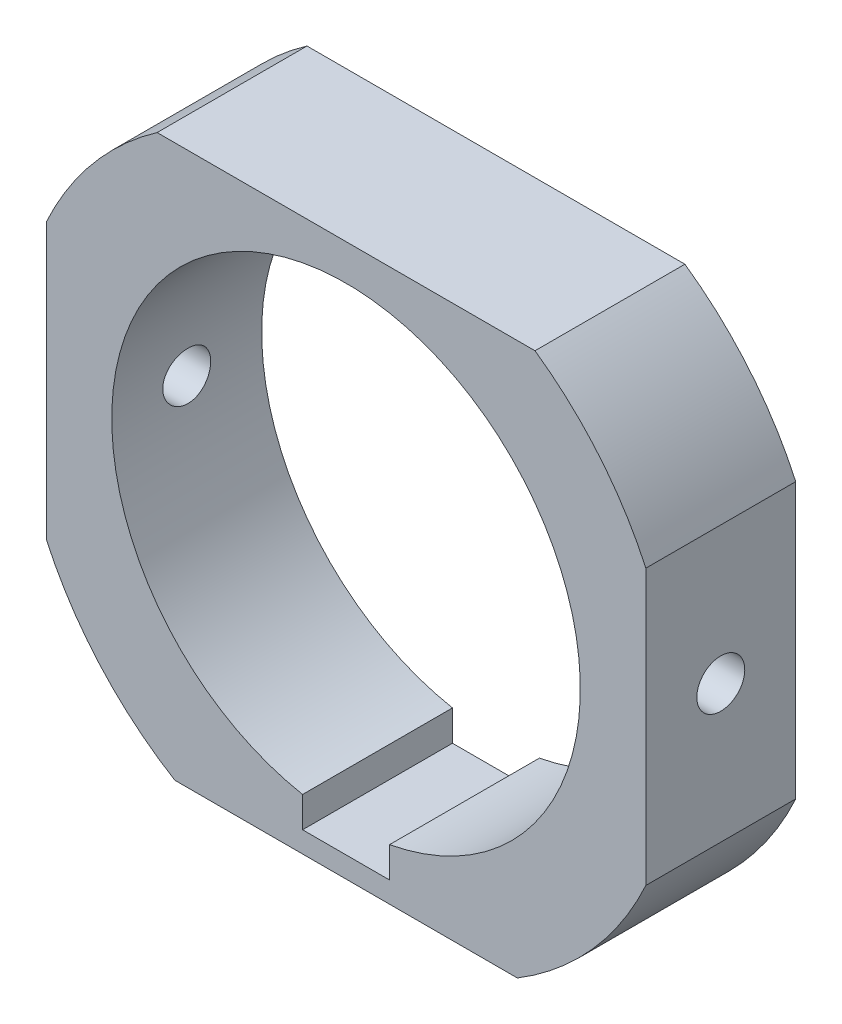
ISO-10303-21;
HEADER;
FILE_DESCRIPTION(('STEP AP214'),'2;1');
FILE_NAME('part.step','',(''),(''),'','','');
FILE_SCHEMA(('AUTOMOTIVE_DESIGN { 1 0 10303 214 1 1 1 1 }'));
ENDSEC;
DATA;
#1=APPLICATION_CONTEXT('core data for automotive mechanical design processes');
#2=APPLICATION_PROTOCOL_DEFINITION('international standard','automotive_design',2000,#1);
#3=PRODUCT_CONTEXT('',#1,'mechanical');
#4=PRODUCT('Part','Part','',(#3));
#5=PRODUCT_RELATED_PRODUCT_CATEGORY('part','',(#4));
#6=PRODUCT_DEFINITION_FORMATION('','',#4);
#7=PRODUCT_DEFINITION_CONTEXT('part definition',#1,'design');
#8=PRODUCT_DEFINITION('design','',#6,#7);
#9=PRODUCT_DEFINITION_SHAPE('','',#8);
#10=(LENGTH_UNIT() NAMED_UNIT(*) SI_UNIT(.MILLI.,.METRE.));
#11=(NAMED_UNIT(*) PLANE_ANGLE_UNIT() SI_UNIT($,.RADIAN.));
#12=(NAMED_UNIT(*) SI_UNIT($,.STERADIAN.) SOLID_ANGLE_UNIT());
#13=UNCERTAINTY_MEASURE_WITH_UNIT(LENGTH_MEASURE(1.E-05),#10,'distance_accuracy_value','');
#14=(GEOMETRIC_REPRESENTATION_CONTEXT(3) GLOBAL_UNCERTAINTY_ASSIGNED_CONTEXT((#13)) GLOBAL_UNIT_ASSIGNED_CONTEXT((#10,
#11,#12)) REPRESENTATION_CONTEXT('',''));
#15=CARTESIAN_POINT('',(0.,0.,0.));
#16=DIRECTION('',(0.,0.,1.));
#17=DIRECTION('',(1.,0.,0.));
#18=AXIS2_PLACEMENT_3D('',#15,#16,#17);
#19=CARTESIAN_POINT('',(10.,0.,5.));
#20=DIRECTION('',(1.,0.,0.));
#21=DIRECTION('',(0.,1.,0.));
#22=AXIS2_PLACEMENT_3D('',#19,#20,#21);
#23=PLANE('',#22);
#24=CARTESIAN_POINT('',(10.,0.,2.5));
#25=DIRECTION('',(1.,0.,0.));
#26=DIRECTION('',(0.,1.,0.));
#27=AXIS2_PLACEMENT_3D('',#24,#25,#26);
#28=CIRCLE('',#27,0.8);
#29=CARTESIAN_POINT('',(10.,0.799999999999986,2.5));
#30=VERTEX_POINT('',#29);
#31=EDGE_CURVE('E295',#30,#30,#28,.T.);
#32=ORIENTED_EDGE('',*,*,#31,.F.);
#33=EDGE_LOOP('',(#32));
#34=FACE_BOUND('',#33,.T.);
#35=DIRECTION('',(0.,-1.,0.));
#36=VECTOR('',#35,1.);
#37=CARTESIAN_POINT('',(10.,0.,0.));
#38=LINE('',#37,#36);
#39=CARTESIAN_POINT('',(10.,4.58257569495583,0.));
#40=VERTEX_POINT('',#39);
#41=CARTESIAN_POINT('',(10.,-4.58257569495586,0.));
#42=VERTEX_POINT('',#41);
#43=EDGE_CURVE('E245',#40,#42,#38,.T.);
#44=ORIENTED_EDGE('',*,*,#43,.F.);
#45=DIRECTION('',(0.,0.,-1.));
#46=VECTOR('',#45,1.);
#47=CARTESIAN_POINT('',(10.,4.58257569495583,5.));
#48=LINE('',#47,#46);
#49=CARTESIAN_POINT('',(10.,4.58257569495583,5.));
#50=VERTEX_POINT('',#49);
#51=EDGE_CURVE('E48',#50,#40,#48,.T.);
#52=ORIENTED_EDGE('',*,*,#51,.F.);
#53=DIRECTION('',(0.,-1.,0.));
#54=VECTOR('',#53,1.);
#55=CARTESIAN_POINT('',(10.,0.,5.));
#56=LINE('',#55,#54);
#57=CARTESIAN_POINT('',(10.,-4.58257569495586,5.));
#58=VERTEX_POINT('',#57);
#59=EDGE_CURVE('E262',#50,#58,#56,.T.);
#60=ORIENTED_EDGE('',*,*,#59,.T.);
#61=DIRECTION('',(0.,0.,-1.));
#62=VECTOR('',#61,1.);
#63=CARTESIAN_POINT('',(10.,-4.58257569495586,5.));
#64=LINE('',#63,#62);
#65=EDGE_CURVE('E167',#58,#42,#64,.T.);
#66=ORIENTED_EDGE('',*,*,#65,.T.);
#67=EDGE_LOOP('',(#44,#52,#60,#66));
#68=FACE_BOUND('',#67,.T.);
#69=ADVANCED_FACE('F35',(#34,#68),#23,.T.);
#70=CARTESIAN_POINT('',(0.,0.,5.));
#71=DIRECTION('',(0.,0.,-1.));
#72=DIRECTION('',(-1.,0.,0.));
#73=AXIS2_PLACEMENT_3D('',#70,#71,#72);
#74=CYLINDRICAL_SURFACE('',#73,11.);
#75=CARTESIAN_POINT('',(0.,0.,0.));
#76=DIRECTION('',(0.,0.,1.));
#77=DIRECTION('',(1.,0.,0.));
#78=AXIS2_PLACEMENT_3D('',#75,#76,#77);
#79=CIRCLE('',#78,11.);
#80=CARTESIAN_POINT('',(6.30315595555117,9.01499999999999,0.));
#81=VERTEX_POINT('',#80);
#82=EDGE_CURVE('E251',#40,#81,#79,.T.);
#83=ORIENTED_EDGE('',*,*,#82,.T.);
#84=DIRECTION('',(0.,0.,-1.));
#85=VECTOR('',#84,1.);
#86=CARTESIAN_POINT('',(6.30315595555117,9.01499999999999,5.));
#87=LINE('',#86,#85);
#88=CARTESIAN_POINT('',(6.30315595555117,9.01499999999999,5.));
#89=VERTEX_POINT('',#88);
#90=EDGE_CURVE('E165',#89,#81,#87,.T.);
#91=ORIENTED_EDGE('',*,*,#90,.F.);
#92=CARTESIAN_POINT('',(0.,0.,5.));
#93=DIRECTION('',(0.,0.,1.));
#94=DIRECTION('',(1.,0.,0.));
#95=AXIS2_PLACEMENT_3D('',#92,#93,#94);
#96=CIRCLE('',#95,11.);
#97=EDGE_CURVE('E159',#50,#89,#96,.T.);
#98=ORIENTED_EDGE('',*,*,#97,.F.);
#99=ORIENTED_EDGE('',*,*,#51,.T.);
#100=EDGE_LOOP('',(#83,#91,#98,#99));
#101=FACE_BOUND('',#100,.T.);
#102=ADVANCED_FACE('F204',(#101),#74,.T.);
#103=CARTESIAN_POINT('',(0.,9.01499999999998,5.));
#104=DIRECTION('',(0.,1.,0.));
#105=DIRECTION('',(-1.,0.,0.));
#106=AXIS2_PLACEMENT_3D('',#103,#104,#105);
#107=PLANE('',#106);
#108=DIRECTION('',(1.,0.,0.));
#109=VECTOR('',#108,1.);
#110=CARTESIAN_POINT('',(0.,9.01499999999998,0.));
#111=LINE('',#110,#109);
#112=CARTESIAN_POINT('',(-6.30315595555117,9.01499999999998,0.));
#113=VERTEX_POINT('',#112);
#114=EDGE_CURVE('E254',#113,#81,#111,.T.);
#115=ORIENTED_EDGE('',*,*,#114,.F.);
#116=DIRECTION('',(0.,0.,-1.));
#117=VECTOR('',#116,1.);
#118=CARTESIAN_POINT('',(-6.30315595555117,9.01499999999998,5.));
#119=LINE('',#118,#117);
#120=CARTESIAN_POINT('',(-6.30315595555117,9.01499999999998,5.));
#121=VERTEX_POINT('',#120);
#122=EDGE_CURVE('E163',#121,#113,#119,.T.);
#123=ORIENTED_EDGE('',*,*,#122,.F.);
#124=DIRECTION('',(1.,0.,0.));
#125=VECTOR('',#124,1.);
#126=CARTESIAN_POINT('',(0.,9.01499999999998,5.));
#127=LINE('',#126,#125);
#128=EDGE_CURVE('E156',#121,#89,#127,.T.);
#129=ORIENTED_EDGE('',*,*,#128,.T.);
#130=ORIENTED_EDGE('',*,*,#90,.T.);
#131=EDGE_LOOP('',(#115,#123,#129,#130));
#132=FACE_BOUND('',#131,.T.);
#133=ADVANCED_FACE('F209',(#132),#107,.T.);
#134=CARTESIAN_POINT('',(-10.,4.58257569495583,0.));
#135=VERTEX_POINT('',#134);
#136=EDGE_CURVE('E162',#113,#135,#79,.T.);
#137=ORIENTED_EDGE('',*,*,#136,.T.);
#138=DIRECTION('',(0.,0.,-1.));
#139=VECTOR('',#138,1.);
#140=CARTESIAN_POINT('',(-10.,4.58257569495583,5.));
#141=LINE('',#140,#139);
#142=CARTESIAN_POINT('',(-10.,4.58257569495583,5.));
#143=VERTEX_POINT('',#142);
#144=EDGE_CURVE('E143',#143,#135,#141,.T.);
#145=ORIENTED_EDGE('',*,*,#144,.F.);
#146=EDGE_CURVE('E149',#121,#143,#96,.T.);
#147=ORIENTED_EDGE('',*,*,#146,.F.);
#148=ORIENTED_EDGE('',*,*,#122,.T.);
#149=EDGE_LOOP('',(#137,#145,#147,#148));
#150=FACE_BOUND('',#149,.T.);
#151=ADVANCED_FACE('F160',(#150),#74,.T.);
#152=CARTESIAN_POINT('',(-10.,0.,5.));
#153=DIRECTION('',(1.,0.,0.));
#154=DIRECTION('',(0.,1.,0.));
#155=AXIS2_PLACEMENT_3D('',#152,#153,#154);
#156=PLANE('',#155);
#157=CARTESIAN_POINT('',(-10.,0.,2.5));
#158=DIRECTION('',(1.,0.,0.));
#159=DIRECTION('',(0.,1.,0.));
#160=AXIS2_PLACEMENT_3D('',#157,#158,#159);
#161=CIRCLE('',#160,0.8);
#162=CARTESIAN_POINT('',(-10.,0.799999999999993,2.5));
#163=VERTEX_POINT('',#162);
#164=EDGE_CURVE('E183',#163,#163,#161,.T.);
#165=ORIENTED_EDGE('',*,*,#164,.T.);
#166=EDGE_LOOP('',(#165));
#167=FACE_BOUND('',#166,.T.);
#168=DIRECTION('',(0.,-1.,0.));
#169=VECTOR('',#168,1.);
#170=CARTESIAN_POINT('',(-10.,0.,0.));
#171=LINE('',#170,#169);
#172=CARTESIAN_POINT('',(-10.,-4.58257569495586,0.));
#173=VERTEX_POINT('',#172);
#174=EDGE_CURVE('E257',#135,#173,#171,.T.);
#175=ORIENTED_EDGE('',*,*,#174,.T.);
#176=DIRECTION('',(0.,0.,-1.));
#177=VECTOR('',#176,1.);
#178=CARTESIAN_POINT('',(-10.,-4.58257569495586,5.));
#179=LINE('',#178,#177);
#180=CARTESIAN_POINT('',(-10.,-4.58257569495586,5.));
#181=VERTEX_POINT('',#180);
#182=EDGE_CURVE('E146',#181,#173,#179,.T.);
#183=ORIENTED_EDGE('',*,*,#182,.F.);
#184=DIRECTION('',(0.,-1.,0.));
#185=VECTOR('',#184,1.);
#186=CARTESIAN_POINT('',(-10.,0.,5.));
#187=LINE('',#186,#185);
#188=EDGE_CURVE('E138',#143,#181,#187,.T.);
#189=ORIENTED_EDGE('',*,*,#188,.F.);
#190=ORIENTED_EDGE('',*,*,#144,.T.);
#191=EDGE_LOOP('',(#175,#183,#189,#190));
#192=FACE_BOUND('',#191,.T.);
#193=ADVANCED_FACE('F141',(#167,#192),#156,.F.);
#194=CARTESIAN_POINT('',(-5.71314274283446,-9.39999999999991,0.));
#195=VERTEX_POINT('',#194);
#196=EDGE_CURVE('E258',#173,#195,#79,.T.);
#197=ORIENTED_EDGE('',*,*,#196,.T.);
#198=DIRECTION('',(0.,0.,-1.));
#199=VECTOR('',#198,1.);
#200=CARTESIAN_POINT('',(-5.71314274283446,-9.39999999999992,5.));
#201=LINE('',#200,#199);
#202=CARTESIAN_POINT('',(-5.71314274283446,-9.39999999999992,5.));
#203=VERTEX_POINT('',#202);
#204=EDGE_CURVE('E56',#195,#203,#201,.F.);
#205=ORIENTED_EDGE('',*,*,#204,.T.);
#206=EDGE_CURVE('E148',#181,#203,#96,.T.);
#207=ORIENTED_EDGE('',*,*,#206,.F.);
#208=ORIENTED_EDGE('',*,*,#182,.T.);
#209=EDGE_LOOP('',(#197,#205,#207,#208));
#210=FACE_BOUND('',#209,.T.);
#211=ADVANCED_FACE('F205',(#210),#74,.T.);
#212=CARTESIAN_POINT('',(0.,0.,5.));
#213=DIRECTION('',(0.,0.,-1.));
#214=DIRECTION('',(-1.,0.,0.));
#215=AXIS2_PLACEMENT_3D('',#212,#213,#214);
#216=CYLINDRICAL_SURFACE('',#215,7.815);
#217=CARTESIAN_POINT('',(-7.77394526607951,0.799999999999993,2.5));
#218=CARTESIAN_POINT('',(-7.77394580313387,0.799998061736724,2.54480986083474));
#219=CARTESIAN_POINT('',(-7.77433687554016,0.796222461421505,2.58964921208095));
#220=CARTESIAN_POINT('',(-7.77585866200741,0.781218110793491,2.67808432731466));
#221=CARTESIAN_POINT('',(-7.7769901875674,0.769981183046168,2.72167867206828));
#222=CARTESIAN_POINT('',(-7.77986339835153,0.740385165842795,2.8063303182318));
#223=CARTESIAN_POINT('',(-7.78160470984275,0.722030438091363,2.84738915554322));
#224=CARTESIAN_POINT('',(-7.78550083147618,0.678728308654285,2.92583457232231));
#225=CARTESIAN_POINT('',(-7.78765556045007,0.653782200725488,2.96322187046692));
#226=CARTESIAN_POINT('',(-7.79214491339251,0.597903538047323,3.03341388721079));
#227=CARTESIAN_POINT('',(-7.79448012139571,0.566951012774912,3.06620267183749));
#228=CARTESIAN_POINT('',(-7.79906201620008,0.49998085219694,3.12612966250422));
#229=CARTESIAN_POINT('',(-7.80130869891789,0.463962983594109,3.15326760813758));
#230=CARTESIAN_POINT('',(-7.80546619156765,0.387786694956044,3.20117784826974));
#231=CARTESIAN_POINT('',(-7.80737625188276,0.347619342075545,3.2219360103129));
#232=CARTESIAN_POINT('',(-7.81063892600844,0.264346264528616,3.256407013596));
#233=CARTESIAN_POINT('',(-7.81199155400921,0.221240614693136,3.27012003418189));
#234=CARTESIAN_POINT('',(-7.81398285836133,0.133475743653092,3.29006467616526));
#235=CARTESIAN_POINT('',(-7.81462403453344,0.0888225342662697,3.29632249856143));
#236=CARTESIAN_POINT('',(-7.81512869685544,-0.000904642598936509,3.30126018922979));
#237=CARTESIAN_POINT('',(-7.81499220406077,-0.0459785986525881,3.29994026267003));
#238=CARTESIAN_POINT('',(-7.81395895161461,-0.135089885253989,3.28978116942611));
#239=CARTESIAN_POINT('',(-7.8130650407122,-0.17913046546611,3.28097017720236));
#240=CARTESIAN_POINT('',(-7.81062067492937,-0.26510444888665,3.25612296925048));
#241=CARTESIAN_POINT('',(-7.80907021117161,-0.307037823594688,3.24008665582764));
#242=CARTESIAN_POINT('',(-7.8054821453633,-0.387695734955676,3.20121320525696));
#243=CARTESIAN_POINT('',(-7.80344365330647,-0.426414232913712,3.17836362399475));
#244=CARTESIAN_POINT('',(-7.79910820983128,-0.499477423321488,3.12652129082424));
#245=CARTESIAN_POINT('',(-7.79681125046814,-0.533821981255624,3.09752835005686));
#246=CARTESIAN_POINT('',(-7.79220414589193,-0.597327440619396,3.0340639028662));
#247=CARTESIAN_POINT('',(-7.78989398851402,-0.626463849431887,2.99956788334724));
#248=CARTESIAN_POINT('',(-7.78553135845153,-0.678536251311329,2.92616141675097));
#249=CARTESIAN_POINT('',(-7.78347888617073,-0.701472234662522,2.88725096275659));
#250=CARTESIAN_POINT('',(-7.77986384756677,-0.740492727854812,2.80610107404496));
#251=CARTESIAN_POINT('',(-7.77830139218661,-0.756575686421836,2.76386088815974));
#252=CARTESIAN_POINT('',(-7.77584556894412,-0.781414012766373,2.67726005353371));
#253=CARTESIAN_POINT('',(-7.77495217969918,-0.790169614719065,2.63289947260656));
#254=CARTESIAN_POINT('',(-7.77393935938322,-0.8000731032596,2.54353221157662));
#255=CARTESIAN_POINT('',(-7.77381644069682,-0.801255272319191,2.49852936850994));
#256=CARTESIAN_POINT('',(-7.7743492732361,-0.796068406801337,2.40896623093414));
#257=CARTESIAN_POINT('',(-7.77500501342687,-0.789699479235747,2.36440593016246));
#258=CARTESIAN_POINT('',(-7.77701810418348,-0.76961990917363,2.27709294812345));
#259=CARTESIAN_POINT('',(-7.77837390222677,-0.755925510011556,2.23433649248693));
#260=CARTESIAN_POINT('',(-7.78163308391878,-0.721600325154456,2.15172751213331));
#261=CARTESIAN_POINT('',(-7.78353648069191,-0.700969373207533,2.11187505704572));
#262=CARTESIAN_POINT('',(-7.78768482886165,-0.653270975015754,2.03604918064636));
#263=CARTESIAN_POINT('',(-7.78993097441594,-0.626180831331106,2.00009010354735));
#264=CARTESIAN_POINT('',(-7.79450784028217,-0.566365533474943,1.93321726603235));
#265=CARTESIAN_POINT('',(-7.79683856278782,-0.533640233059086,1.90230363659704));
#266=CARTESIAN_POINT('',(-7.80133251156171,-0.463334759082683,1.84628080771017));
#267=CARTESIAN_POINT('',(-7.80349507151783,-0.425736704829036,1.82119398660156));
#268=CARTESIAN_POINT('',(-7.80739930988799,-0.346841196308256,1.7776909622064));
#269=CARTESIAN_POINT('',(-7.8091409943082,-0.305543794844931,1.75927466372494));
#270=CARTESIAN_POINT('',(-7.81200423536476,-0.220499668639464,1.72967329156506));
#271=CARTESIAN_POINT('',(-7.81312694626303,-0.176757671572313,1.71847475156827));
#272=CARTESIAN_POINT('',(-7.81463048182995,-0.0880021608086677,1.70358284417057));
#273=CARTESIAN_POINT('',(-7.81501132841863,-0.0429886847207331,1.69988925501898));
#274=CARTESIAN_POINT('',(-7.81498820517644,0.0468123212288254,1.7001153008142));
#275=CARTESIAN_POINT('',(-7.81458781447629,0.0915999434503081,1.70400021587262));
#276=CARTESIAN_POINT('',(-7.81305427152202,0.179882711651269,1.719200124063));
#277=CARTESIAN_POINT('',(-7.81192111876967,0.223377856751913,1.73051512224701));
#278=CARTESIAN_POINT('',(-7.80904899208022,0.30784036159003,1.76024427250835));
#279=CARTESIAN_POINT('',(-7.80731010968926,0.348808102202667,1.77865735187158));
#280=CARTESIAN_POINT('',(-7.8034202474717,0.427077016176679,1.8220563003507));
#281=CARTESIAN_POINT('',(-7.80126926942119,0.464378205339359,1.84704214113903));
#282=CARTESIAN_POINT('',(-7.79678432930458,0.534433075382701,1.90300743396359));
#283=CARTESIAN_POINT('',(-7.79444960460488,0.567166050428364,1.93401274413989));
#284=CARTESIAN_POINT('',(-7.78986673365381,0.626979782575166,2.00108550945176));
#285=CARTESIAN_POINT('',(-7.78761860828681,0.654059183128778,2.03715417605081));
#286=CARTESIAN_POINT('',(-7.78345709954378,0.701854278379384,2.11343502634024));
#287=CARTESIAN_POINT('',(-7.78154461947297,0.722552910615729,2.15365794220618));
#288=CARTESIAN_POINT('',(-7.77828168033427,0.75687452262133,2.23700268007272));
#289=CARTESIAN_POINT('',(-7.77693058960545,0.770505459086838,2.28012118020647));
#290=CARTESIAN_POINT('',(-7.7752830595344,0.786917090265315,2.352901767449));
#291=CARTESIAN_POINT('',(-7.77478377002186,0.791816447095742,2.38209903892744));
#292=CARTESIAN_POINT('',(-7.7741146967887,0.79835853437849,2.44085992545233));
#293=CARTESIAN_POINT('',(-7.77394491160022,0.800001279338227,2.47042353886622));
#294=CARTESIAN_POINT('',(-7.77394526607951,0.799999999999993,2.5));
#295=B_SPLINE_CURVE_WITH_KNOTS('',3,(#217,#218,#219,#220,#221,#222,#223,#224,#225,#226,#227,
#228,#229,#230,#231,#232,#233,#234,#235,#236,#237,#238,#239,#240,#241,#242,#243,#244,#245,#246,
#247,#248,#249,#250,#251,#252,#253,#254,#255,#256,#257,#258,#259,#260,#261,#262,#263,#264,#265,
#266,#267,#268,#269,#270,#271,#272,#273,#274,#275,#276,#277,#278,#279,#280,#281,#282,#283,#284,
#285,#286,#287,#288,#289,#290,#291,#292,#293,#294),.UNSPECIFIED.,.T.,.F.,(4,2,2,2,2,2,2,2,2,2,2,
2,2,2,2,2,2,2,2,2,2,2,2,2,2,2,2,2,2,2,2,2,2,2,2,2,2,2,4),(0.,0.134321571237767,
0.268790599193194,0.403177355980196,0.537537754888678,0.672352784495582,0.807174025386329,
0.942291803891549,1.07740614257531,1.21204421310606,1.34667863831926,1.48080892208956,
1.61494101951111,1.74931961939689,1.88370235094784,2.01870131415718,2.15370048890197,
2.28873020630739,2.42375560812975,2.55816935933826,2.69258120569854,2.82669623828051,
2.96081448549499,3.09541115301858,3.23001131413952,3.3651201722798,3.50022710220806,
3.63508122508282,3.76993136333085,3.90416515470384,4.03839903734854,4.17261264153244,
4.30682566728641,4.44162853245895,4.57646370583924,4.7116563680379,4.84669650027642,
4.93535498648731,5.02401307774526),.UNSPECIFIED.);
#296=CARTESIAN_POINT('',(-7.77394526607951,0.799999999999993,2.5));
#297=VERTEX_POINT('',#296);
#298=EDGE_CURVE('E40',#297,#297,#295,.T.);
#299=ORIENTED_EDGE('',*,*,#298,.F.);
#300=EDGE_LOOP('',(#299));
#301=FACE_BOUND('',#300,.T.);
#302=CARTESIAN_POINT('',(7.77394526607951,0.799999999999987,2.5));
#303=CARTESIAN_POINT('',(7.77394580313387,0.799998061736718,2.45519013916526));
#304=CARTESIAN_POINT('',(7.77433687554016,0.796222461421499,2.41035078791905));
#305=CARTESIAN_POINT('',(7.77585866200741,0.781218110793486,2.32191567268534));
#306=CARTESIAN_POINT('',(7.7769901875674,0.769981183046162,2.27832132793173));
#307=CARTESIAN_POINT('',(7.77986339835154,0.740385165842789,2.1936696817682));
#308=CARTESIAN_POINT('',(7.78160470984275,0.722030438091357,2.15261084445678));
#309=CARTESIAN_POINT('',(7.78550083147618,0.678728308654279,2.07416542767769));
#310=CARTESIAN_POINT('',(7.78765556045007,0.653782200725482,2.03677812953308));
#311=CARTESIAN_POINT('',(7.79214491339251,0.597903538047317,1.96658611278921));
#312=CARTESIAN_POINT('',(7.79448012139571,0.566951012774906,1.93379732816251));
#313=CARTESIAN_POINT('',(7.79906201620008,0.499980852196934,1.87387033749578));
#314=CARTESIAN_POINT('',(7.8013086989179,0.463962983594102,1.84673239186242));
#315=CARTESIAN_POINT('',(7.80546619156765,0.387786694956038,1.79882215173026));
#316=CARTESIAN_POINT('',(7.80737625188276,0.347619342075539,1.7780639896871));
#317=CARTESIAN_POINT('',(7.81063892600844,0.26434626452861,1.743592986404));
#318=CARTESIAN_POINT('',(7.81199155400921,0.221240614693131,1.72987996581811));
#319=CARTESIAN_POINT('',(7.81398285836133,0.133475743653086,1.70993532383474));
#320=CARTESIAN_POINT('',(7.81462403453344,0.0888225342662642,1.70367750143857));
#321=CARTESIAN_POINT('',(7.81512869685544,-0.00090464259894214,1.69873981077021));
#322=CARTESIAN_POINT('',(7.81499220406077,-0.0459785986525938,1.70005973732998));
#323=CARTESIAN_POINT('',(7.81395895161461,-0.135089885253995,1.71021883057389));
#324=CARTESIAN_POINT('',(7.8130650407122,-0.179130465466116,1.71902982279764));
#325=CARTESIAN_POINT('',(7.81062067492937,-0.265104448886656,1.74387703074952));
#326=CARTESIAN_POINT('',(7.80907021117161,-0.307037823594693,1.75991334417236));
#327=CARTESIAN_POINT('',(7.8054821453633,-0.387695734955682,1.79878679474304));
#328=CARTESIAN_POINT('',(7.80344365330647,-0.426414232913718,1.82163637600526));
#329=CARTESIAN_POINT('',(7.79910820983128,-0.499477423321494,1.87347870917576));
#330=CARTESIAN_POINT('',(7.79681125046814,-0.53382198125563,1.90247164994315));
#331=CARTESIAN_POINT('',(7.79220414589193,-0.597327440619402,1.9659360971338));
#332=CARTESIAN_POINT('',(7.78989398851402,-0.626463849431893,2.00043211665276));
#333=CARTESIAN_POINT('',(7.78553135845153,-0.678536251311335,2.07383858324903));
#334=CARTESIAN_POINT('',(7.78347888617073,-0.701472234662528,2.11274903724341));
#335=CARTESIAN_POINT('',(7.77986384756677,-0.740492727854818,2.19389892595504));
#336=CARTESIAN_POINT('',(7.77830139218661,-0.756575686421842,2.23613911184026));
#337=CARTESIAN_POINT('',(7.77584556894412,-0.781414012766379,2.32273994646629));
#338=CARTESIAN_POINT('',(7.77495217969918,-0.790169614719071,2.36710052739345));
#339=CARTESIAN_POINT('',(7.77393935938322,-0.800073103259606,2.45646778842338));
#340=CARTESIAN_POINT('',(7.77381644069682,-0.801255272319197,2.50147063149006));
#341=CARTESIAN_POINT('',(7.7743492732361,-0.796068406801343,2.59103376906586));
#342=CARTESIAN_POINT('',(7.77500501342687,-0.789699479235753,2.63559406983754));
#343=CARTESIAN_POINT('',(7.77701810418348,-0.769619909173636,2.72290705187655));
#344=CARTESIAN_POINT('',(7.77837390222677,-0.755925510011562,2.76566350751307));
#345=CARTESIAN_POINT('',(7.78163308391877,-0.721600325154461,2.84827248786669));
#346=CARTESIAN_POINT('',(7.78353648069191,-0.700969373207539,2.88812494295428));
#347=CARTESIAN_POINT('',(7.78768482886165,-0.65327097501576,2.96395081935365));
#348=CARTESIAN_POINT('',(7.78993097441594,-0.626180831331112,2.99990989645265));
#349=CARTESIAN_POINT('',(7.79450784028217,-0.566365533474949,3.06678273396766));
#350=CARTESIAN_POINT('',(7.79683856278782,-0.533640233059092,3.09769636340296));
#351=CARTESIAN_POINT('',(7.80133251156171,-0.463334759082689,3.15371919228983));
#352=CARTESIAN_POINT('',(7.80349507151783,-0.425736704829042,3.17880601339844));
#353=CARTESIAN_POINT('',(7.80739930988799,-0.346841196308262,3.2223090377936));
#354=CARTESIAN_POINT('',(7.8091409943082,-0.305543794844937,3.24072533627506));
#355=CARTESIAN_POINT('',(7.81200423536476,-0.22049966863947,3.27032670843494));
#356=CARTESIAN_POINT('',(7.81312694626303,-0.176757671572318,3.28152524843173));
#357=CARTESIAN_POINT('',(7.81463048182995,-0.0880021608086733,3.29641715582943));
#358=CARTESIAN_POINT('',(7.81501132841863,-0.0429886847207389,3.30011074498102));
#359=CARTESIAN_POINT('',(7.81498820517644,0.0468123212288193,3.2998846991858));
#360=CARTESIAN_POINT('',(7.81458781447629,0.091599943450302,3.29599978412738));
#361=CARTESIAN_POINT('',(7.81305427152202,0.179882711651263,3.280799875937));
#362=CARTESIAN_POINT('',(7.81192111876967,0.223377856751907,3.26948487775299));
#363=CARTESIAN_POINT('',(7.80904899208022,0.307840361590024,3.23975572749165));
#364=CARTESIAN_POINT('',(7.80731010968926,0.348808102202661,3.22134264812842));
#365=CARTESIAN_POINT('',(7.8034202474717,0.427077016176673,3.1779436996493));
#366=CARTESIAN_POINT('',(7.80126926942119,0.464378205339353,3.15295785886097));
#367=CARTESIAN_POINT('',(7.79678432930458,0.534433075382695,3.09699256603641));
#368=CARTESIAN_POINT('',(7.79444960460488,0.567166050428358,3.06598725586011));
#369=CARTESIAN_POINT('',(7.78986673365381,0.62697978257516,2.99891449054824));
#370=CARTESIAN_POINT('',(7.78761860828681,0.654059183128772,2.9628458239492));
#371=CARTESIAN_POINT('',(7.78345709954378,0.701854278379378,2.88656497365977));
#372=CARTESIAN_POINT('',(7.78154461947297,0.722552910615723,2.84634205779383));
#373=CARTESIAN_POINT('',(7.77828168033427,0.756874522621324,2.76299731992728));
#374=CARTESIAN_POINT('',(7.77693058960545,0.770505459086832,2.71987881979353));
#375=CARTESIAN_POINT('',(7.7752830595344,0.78691709026531,2.64709823255101));
#376=CARTESIAN_POINT('',(7.77478377002186,0.791816447095736,2.61790096107256));
#377=CARTESIAN_POINT('',(7.7741146967887,0.798358534378484,2.55914007454767));
#378=CARTESIAN_POINT('',(7.77394491160022,0.800001279338221,2.52957646113378));
#379=CARTESIAN_POINT('',(7.77394526607951,0.799999999999987,2.5));
#380=B_SPLINE_CURVE_WITH_KNOTS('',3,(#302,#303,#304,#305,#306,#307,#308,#309,#310,#311,#312,
#313,#314,#315,#316,#317,#318,#319,#320,#321,#322,#323,#324,#325,#326,#327,#328,#329,#330,#331,
#332,#333,#334,#335,#336,#337,#338,#339,#340,#341,#342,#343,#344,#345,#346,#347,#348,#349,#350,
#351,#352,#353,#354,#355,#356,#357,#358,#359,#360,#361,#362,#363,#364,#365,#366,#367,#368,#369,
#370,#371,#372,#373,#374,#375,#376,#377,#378,#379),.UNSPECIFIED.,.T.,.F.,(4,2,2,2,2,2,2,2,2,2,2,
2,2,2,2,2,2,2,2,2,2,2,2,2,2,2,2,2,2,2,2,2,2,2,2,2,2,2,4),(0.,0.134321571237767,
0.268790599193194,0.403177355980196,0.537537754888678,0.672352784495582,0.807174025386329,
0.942291803891549,1.07740614257531,1.21204421310606,1.34667863831926,1.48080892208956,
1.61494101951111,1.74931961939689,1.88370235094784,2.01870131415719,2.15370048890197,
2.28873020630739,2.42375560812975,2.55816935933827,2.69258120569854,2.82669623828051,
2.96081448549499,3.09541115301858,3.23001131413952,3.3651201722798,3.50022710220806,
3.63508122508282,3.76993136333085,3.90416515470384,4.03839903734854,4.17261264153244,
4.30682566728641,4.44162853245895,4.57646370583924,4.7116563680379,4.84669650027642,
4.93535498648731,5.02401307774526),.UNSPECIFIED.);
#381=CARTESIAN_POINT('',(7.77394526607951,0.799999999999987,2.5));
#382=VERTEX_POINT('',#381);
#383=EDGE_CURVE('E179',#382,#382,#380,.T.);
#384=ORIENTED_EDGE('',*,*,#383,.F.);
#385=EDGE_LOOP('',(#384));
#386=FACE_BOUND('',#385,.T.);
#387=CARTESIAN_POINT('',(0.,0.,0.));
#388=DIRECTION('',(0.,0.,1.));
#389=DIRECTION('',(1.,0.,0.));
#390=AXIS2_PLACEMENT_3D('',#387,#388,#389);
#391=CIRCLE('',#390,7.815);
#392=CARTESIAN_POINT('',(1.45,-7.67930498157224,0.));
#393=VERTEX_POINT('',#392);
#394=CARTESIAN_POINT('',(-1.45,-7.67930498157224,0.));
#395=VERTEX_POINT('',#394);
#396=EDGE_CURVE('E237',#393,#395,#391,.T.);
#397=ORIENTED_EDGE('',*,*,#396,.F.);
#398=DIRECTION('',(0.,0.,-1.));
#399=VECTOR('',#398,1.);
#400=CARTESIAN_POINT('',(1.45,-7.67930498157224,5.));
#401=LINE('',#400,#399);
#402=CARTESIAN_POINT('',(1.45,-7.67930498157224,5.));
#403=VERTEX_POINT('',#402);
#404=EDGE_CURVE('E112',#403,#393,#401,.T.);
#405=ORIENTED_EDGE('',*,*,#404,.F.);
#406=CARTESIAN_POINT('',(0.,0.,5.));
#407=DIRECTION('',(0.,0.,1.));
#408=DIRECTION('',(1.,0.,0.));
#409=AXIS2_PLACEMENT_3D('',#406,#407,#408);
#410=CIRCLE('',#409,7.815);
#411=CARTESIAN_POINT('',(-1.45,-7.67930498157224,5.));
#412=VERTEX_POINT('',#411);
#413=EDGE_CURVE('E283',#403,#412,#410,.T.);
#414=ORIENTED_EDGE('',*,*,#413,.T.);
#415=DIRECTION('',(0.,0.,-1.));
#416=VECTOR('',#415,1.);
#417=CARTESIAN_POINT('',(-1.45,-7.67930498157224,5.));
#418=LINE('',#417,#416);
#419=EDGE_CURVE('E173',#412,#395,#418,.T.);
#420=ORIENTED_EDGE('',*,*,#419,.T.);
#421=EDGE_LOOP('',(#397,#405,#414,#420));
#422=FACE_BOUND('',#421,.T.);
#423=ADVANCED_FACE('F37',(#301,#386,#422),#216,.F.);
#424=CARTESIAN_POINT('',(1.45,0.,5.));
#425=DIRECTION('',(-1.,0.,0.));
#426=DIRECTION('',(0.,0.,1.));
#427=AXIS2_PLACEMENT_3D('',#424,#425,#426);
#428=PLANE('',#427);
#429=DIRECTION('',(0.,1.,0.));
#430=VECTOR('',#429,1.);
#431=CARTESIAN_POINT('',(1.45,0.,0.));
#432=LINE('',#431,#430);
#433=CARTESIAN_POINT('',(1.45,-8.69999999999992,0.));
#434=VERTEX_POINT('',#433);
#435=EDGE_CURVE('E231',#434,#393,#432,.T.);
#436=ORIENTED_EDGE('',*,*,#435,.F.);
#437=DIRECTION('',(0.,0.,-1.));
#438=VECTOR('',#437,1.);
#439=CARTESIAN_POINT('',(1.45,-8.69999999999992,5.));
#440=LINE('',#439,#438);
#441=CARTESIAN_POINT('',(1.45,-8.69999999999992,5.));
#442=VERTEX_POINT('',#441);
#443=EDGE_CURVE('E177',#442,#434,#440,.T.);
#444=ORIENTED_EDGE('',*,*,#443,.F.);
#445=DIRECTION('',(0.,1.,0.));
#446=VECTOR('',#445,1.);
#447=CARTESIAN_POINT('',(1.45,0.,5.));
#448=LINE('',#447,#446);
#449=EDGE_CURVE('E285',#442,#403,#448,.T.);
#450=ORIENTED_EDGE('',*,*,#449,.T.);
#451=ORIENTED_EDGE('',*,*,#404,.T.);
#452=EDGE_LOOP('',(#436,#444,#450,#451));
#453=FACE_BOUND('',#452,.T.);
#454=ADVANCED_FACE('F221',(#453),#428,.T.);
#455=CARTESIAN_POINT('',(0.,-8.69999999999992,5.));
#456=DIRECTION('',(0.,1.,0.));
#457=DIRECTION('',(0.,0.,1.));
#458=AXIS2_PLACEMENT_3D('',#455,#456,#457);
#459=PLANE('',#458);
#460=DIRECTION('',(1.,0.,0.));
#461=VECTOR('',#460,1.);
#462=CARTESIAN_POINT('',(0.,-8.69999999999992,0.));
#463=LINE('',#462,#461);
#464=CARTESIAN_POINT('',(-1.45,-8.69999999999992,0.));
#465=VERTEX_POINT('',#464);
#466=EDGE_CURVE('E236',#465,#434,#463,.T.);
#467=ORIENTED_EDGE('',*,*,#466,.F.);
#468=DIRECTION('',(0.,0.,-1.));
#469=VECTOR('',#468,1.);
#470=CARTESIAN_POINT('',(-1.45,-8.69999999999992,5.));
#471=LINE('',#470,#469);
#472=CARTESIAN_POINT('',(-1.45,-8.69999999999992,5.));
#473=VERTEX_POINT('',#472);
#474=EDGE_CURVE('E175',#473,#465,#471,.T.);
#475=ORIENTED_EDGE('',*,*,#474,.F.);
#476=DIRECTION('',(1.,0.,0.));
#477=VECTOR('',#476,1.);
#478=CARTESIAN_POINT('',(0.,-8.69999999999992,5.));
#479=LINE('',#478,#477);
#480=EDGE_CURVE('E270',#473,#442,#479,.T.);
#481=ORIENTED_EDGE('',*,*,#480,.T.);
#482=ORIENTED_EDGE('',*,*,#443,.T.);
#483=EDGE_LOOP('',(#467,#475,#481,#482));
#484=FACE_BOUND('',#483,.T.);
#485=ADVANCED_FACE('F218',(#484),#459,.T.);
#486=CARTESIAN_POINT('',(-1.45,0.,5.));
#487=DIRECTION('',(-1.,0.,0.));
#488=DIRECTION('',(0.,0.,1.));
#489=AXIS2_PLACEMENT_3D('',#486,#487,#488);
#490=PLANE('',#489);
#491=DIRECTION('',(0.,1.,0.));
#492=VECTOR('',#491,1.);
#493=CARTESIAN_POINT('',(-1.45,0.,0.));
#494=LINE('',#493,#492);
#495=EDGE_CURVE('E243',#465,#395,#494,.T.);
#496=ORIENTED_EDGE('',*,*,#495,.T.);
#497=ORIENTED_EDGE('',*,*,#419,.F.);
#498=DIRECTION('',(0.,1.,0.));
#499=VECTOR('',#498,1.);
#500=CARTESIAN_POINT('',(-1.45,0.,5.));
#501=LINE('',#500,#499);
#502=EDGE_CURVE('E268',#473,#412,#501,.T.);
#503=ORIENTED_EDGE('',*,*,#502,.F.);
#504=ORIENTED_EDGE('',*,*,#474,.T.);
#505=EDGE_LOOP('',(#496,#497,#503,#504));
#506=FACE_BOUND('',#505,.T.);
#507=ADVANCED_FACE('F203',(#506),#490,.F.);
#508=CARTESIAN_POINT('',(5.71314274283446,-9.39999999999992,5.));
#509=VERTEX_POINT('',#508);
#510=EDGE_CURVE('E64',#509,#58,#96,.T.);
#511=ORIENTED_EDGE('',*,*,#510,.F.);
#512=DIRECTION('',(0.,0.,-1.));
#513=VECTOR('',#512,1.);
#514=CARTESIAN_POINT('',(5.71314274283446,-9.39999999999992,5.));
#515=LINE('',#514,#513);
#516=CARTESIAN_POINT('',(5.71314274283446,-9.39999999999991,0.));
#517=VERTEX_POINT('',#516);
#518=EDGE_CURVE('E274',#509,#517,#515,.T.);
#519=ORIENTED_EDGE('',*,*,#518,.T.);
#520=EDGE_CURVE('E104',#517,#42,#79,.T.);
#521=ORIENTED_EDGE('',*,*,#520,.T.);
#522=ORIENTED_EDGE('',*,*,#65,.F.);
#523=EDGE_LOOP('',(#511,#519,#521,#522));
#524=FACE_BOUND('',#523,.T.);
#525=ADVANCED_FACE('F197',(#524),#74,.T.);
#526=CARTESIAN_POINT('',(0.,0.,5.));
#527=DIRECTION('',(0.,0.,1.));
#528=DIRECTION('',(1.,0.,0.));
#529=AXIS2_PLACEMENT_3D('',#526,#527,#528);
#530=PLANE('',#529);
#531=DIRECTION('',(1.,0.,0.));
#532=VECTOR('',#531,1.);
#533=CARTESIAN_POINT('',(-10.,-9.39999999999992,5.));
#534=LINE('',#533,#532);
#535=EDGE_CURVE('E279',#203,#509,#534,.T.);
#536=ORIENTED_EDGE('',*,*,#535,.T.);
#537=ORIENTED_EDGE('',*,*,#510,.T.);
#538=ORIENTED_EDGE('',*,*,#59,.F.);
#539=ORIENTED_EDGE('',*,*,#97,.T.);
#540=ORIENTED_EDGE('',*,*,#128,.F.);
#541=ORIENTED_EDGE('',*,*,#146,.T.);
#542=ORIENTED_EDGE('',*,*,#188,.T.);
#543=ORIENTED_EDGE('',*,*,#206,.T.);
#544=EDGE_LOOP('',(#536,#537,#538,#539,#540,#541,#542,#543));
#545=FACE_BOUND('',#544,.T.);
#546=ORIENTED_EDGE('',*,*,#413,.F.);
#547=ORIENTED_EDGE('',*,*,#449,.F.);
#548=ORIENTED_EDGE('',*,*,#480,.F.);
#549=ORIENTED_EDGE('',*,*,#502,.T.);
#550=EDGE_LOOP('',(#546,#547,#548,#549));
#551=FACE_BOUND('',#550,.T.);
#552=ADVANCED_FACE('F153',(#545,#551),#530,.T.);
#553=CARTESIAN_POINT('',(0.,0.,0.));
#554=DIRECTION('',(0.,0.,1.));
#555=DIRECTION('',(1.,0.,0.));
#556=AXIS2_PLACEMENT_3D('',#553,#554,#555);
#557=PLANE('',#556);
#558=ORIENTED_EDGE('',*,*,#396,.T.);
#559=ORIENTED_EDGE('',*,*,#495,.F.);
#560=ORIENTED_EDGE('',*,*,#466,.T.);
#561=ORIENTED_EDGE('',*,*,#435,.T.);
#562=EDGE_LOOP('',(#558,#559,#560,#561));
#563=FACE_BOUND('',#562,.T.);
#564=ORIENTED_EDGE('',*,*,#520,.F.);
#565=DIRECTION('',(-1.,0.,0.));
#566=VECTOR('',#565,1.);
#567=CARTESIAN_POINT('',(0.,-9.39999999999991,0.));
#568=LINE('',#567,#566);
#569=EDGE_CURVE('E11',#517,#195,#568,.T.);
#570=ORIENTED_EDGE('',*,*,#569,.T.);
#571=ORIENTED_EDGE('',*,*,#196,.F.);
#572=ORIENTED_EDGE('',*,*,#174,.F.);
#573=ORIENTED_EDGE('',*,*,#136,.F.);
#574=ORIENTED_EDGE('',*,*,#114,.T.);
#575=ORIENTED_EDGE('',*,*,#82,.F.);
#576=ORIENTED_EDGE('',*,*,#43,.T.);
#577=EDGE_LOOP('',(#564,#570,#571,#572,#573,#574,#575,#576));
#578=FACE_BOUND('',#577,.T.);
#579=ADVANCED_FACE('F194',(#563,#578),#557,.F.);
#580=CARTESIAN_POINT('',(-10.,-9.39999999999991,0.));
#581=DIRECTION('',(0.,1.,0.));
#582=DIRECTION('',(0.,0.,1.));
#583=AXIS2_PLACEMENT_3D('',#580,#581,#582);
#584=PLANE('',#583);
#585=ORIENTED_EDGE('',*,*,#569,.F.);
#586=ORIENTED_EDGE('',*,*,#518,.F.);
#587=ORIENTED_EDGE('',*,*,#535,.F.);
#588=ORIENTED_EDGE('',*,*,#204,.F.);
#589=EDGE_LOOP('',(#585,#586,#587,#588));
#590=FACE_BOUND('',#589,.T.);
#591=ADVANCED_FACE('F189',(#590),#584,.F.);
#592=CARTESIAN_POINT('',(-10.,0.,2.5));
#593=DIRECTION('',(1.,0.,0.));
#594=DIRECTION('',(0.,1.,0.));
#595=AXIS2_PLACEMENT_3D('',#592,#593,#594);
#596=CYLINDRICAL_SURFACE('',#595,0.8);
#597=ORIENTED_EDGE('',*,*,#383,.T.);
#598=EDGE_LOOP('',(#597));
#599=FACE_BOUND('',#598,.T.);
#600=ORIENTED_EDGE('',*,*,#31,.T.);
#601=EDGE_LOOP('',(#600));
#602=FACE_BOUND('',#601,.T.);
#603=ADVANCED_FACE('F184',(#599,#602),#596,.F.);
#604=ORIENTED_EDGE('',*,*,#298,.T.);
#605=EDGE_LOOP('',(#604));
#606=FACE_BOUND('',#605,.T.);
#607=ORIENTED_EDGE('',*,*,#164,.F.);
#608=EDGE_LOOP('',(#607));
#609=FACE_BOUND('',#608,.T.);
#610=ADVANCED_FACE('F188',(#606,#609),#596,.F.);
#611=CLOSED_SHELL('',(#69,#102,#133,#151,#193,#211,#423,#454,#485,#507,#525,#552,#579,#591,#603,#610));
#612=MANIFOLD_SOLID_BREP('B2',#611);
#613=ADVANCED_BREP_SHAPE_REPRESENTATION('',(#18,#612),#14);
#614=SHAPE_DEFINITION_REPRESENTATION(#9,#613);
ENDSEC;
END-ISO-10303-21;
